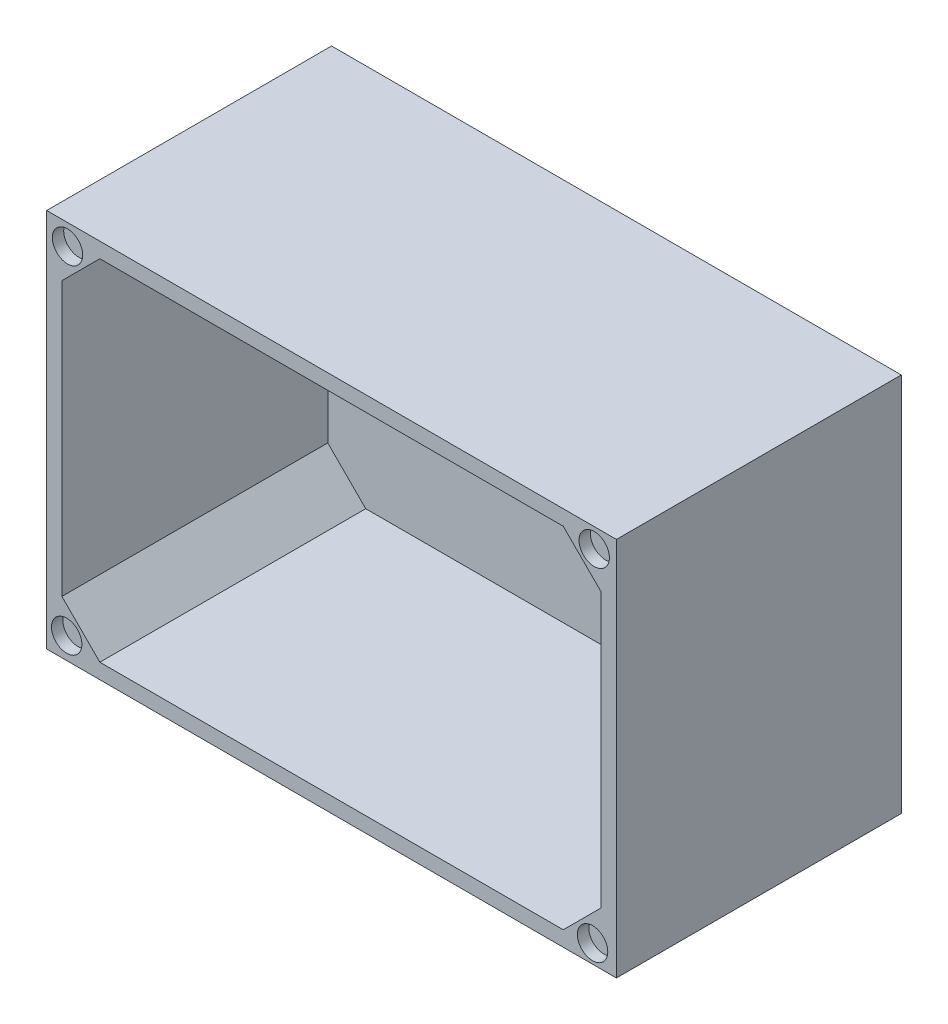
ISO-10303-21;
HEADER;
FILE_DESCRIPTION(('STEP AP214'),'2;1');
FILE_NAME('part.step','',(''),(''),'','','');
FILE_SCHEMA(('AUTOMOTIVE_DESIGN { 1 0 10303 214 1 1 1 1 }'));
ENDSEC;
DATA;
#1=APPLICATION_CONTEXT('core data for automotive mechanical design processes');
#2=APPLICATION_PROTOCOL_DEFINITION('international standard','automotive_design',2000,#1);
#3=PRODUCT_CONTEXT('',#1,'mechanical');
#4=PRODUCT('Part','Part','',(#3));
#5=PRODUCT_RELATED_PRODUCT_CATEGORY('part','',(#4));
#6=PRODUCT_DEFINITION_FORMATION('','',#4);
#7=PRODUCT_DEFINITION_CONTEXT('part definition',#1,'design');
#8=PRODUCT_DEFINITION('design','',#6,#7);
#9=PRODUCT_DEFINITION_SHAPE('','',#8);
#10=(LENGTH_UNIT() NAMED_UNIT(*) SI_UNIT(.MILLI.,.METRE.));
#11=(NAMED_UNIT(*) PLANE_ANGLE_UNIT() SI_UNIT($,.RADIAN.));
#12=(NAMED_UNIT(*) SI_UNIT($,.STERADIAN.) SOLID_ANGLE_UNIT());
#13=UNCERTAINTY_MEASURE_WITH_UNIT(LENGTH_MEASURE(1.E-05),#10,'distance_accuracy_value','');
#14=(GEOMETRIC_REPRESENTATION_CONTEXT(3) GLOBAL_UNCERTAINTY_ASSIGNED_CONTEXT((#13)) GLOBAL_UNIT_ASSIGNED_CONTEXT((#10,
#11,#12)) REPRESENTATION_CONTEXT('',''));
#15=CARTESIAN_POINT('',(0.,0.,0.));
#16=DIRECTION('',(0.,0.,1.));
#17=DIRECTION('',(1.,0.,0.));
#18=AXIS2_PLACEMENT_3D('',#15,#16,#17);
#19=CARTESIAN_POINT('',(0.,0.,75.0000000000001));
#20=DIRECTION('',(0.,0.,1.));
#21=DIRECTION('',(1.,0.,0.));
#22=AXIS2_PLACEMENT_3D('',#19,#20,#21);
#23=PLANE('',#22);
#24=CARTESIAN_POINT('',(92.9547795066869,-5.11567158608324,75.0000000000001));
#25=DIRECTION('',(0.,0.,1.));
#26=DIRECTION('',(1.,0.,0.));
#27=AXIS2_PLACEMENT_3D('',#24,#25,#26);
#28=CIRCLE('',#27,4.00000000000001);
#29=CARTESIAN_POINT('',(96.9547795066869,-5.11567158608324,75.0000000000001));
#30=VERTEX_POINT('',#29);
#31=EDGE_CURVE('E302',#30,#30,#28,.T.);
#32=ORIENTED_EDGE('',*,*,#31,.F.);
#33=EDGE_LOOP('',(#32));
#34=FACE_BOUND('',#33,.T.);
#35=CARTESIAN_POINT('',(92.5260140571219,-95.1957072309636,75.0000000000001));
#36=DIRECTION('',(0.,0.,1.));
#37=DIRECTION('',(1.,0.,0.));
#38=AXIS2_PLACEMENT_3D('',#35,#36,#37);
#39=CIRCLE('',#38,4.00000000000001);
#40=CARTESIAN_POINT('',(96.5260140571219,-95.1957072309636,75.0000000000001));
#41=VERTEX_POINT('',#40);
#42=EDGE_CURVE('E310',#41,#41,#39,.T.);
#43=ORIENTED_EDGE('',*,*,#42,.F.);
#44=EDGE_LOOP('',(#43));
#45=FACE_BOUND('',#44,.T.);
#46=CARTESIAN_POINT('',(-45.9310016615479,-94.3213659545927,75.0000000000001));
#47=DIRECTION('',(0.,0.,1.));
#48=DIRECTION('',(1.,0.,0.));
#49=AXIS2_PLACEMENT_3D('',#46,#47,#48);
#50=CIRCLE('',#49,4.00000000000001);
#51=CARTESIAN_POINT('',(-41.9310016615479,-94.3213659545927,75.0000000000001));
#52=VERTEX_POINT('',#51);
#53=EDGE_CURVE('E320',#52,#52,#50,.T.);
#54=ORIENTED_EDGE('',*,*,#53,.F.);
#55=EDGE_LOOP('',(#54));
#56=FACE_BOUND('',#55,.T.);
#57=CARTESIAN_POINT('',(-45.7114952001511,-5.44696224153471,75.0000000000001));
#58=DIRECTION('',(0.,0.,1.));
#59=DIRECTION('',(1.,0.,0.));
#60=AXIS2_PLACEMENT_3D('',#57,#58,#59);
#61=CIRCLE('',#60,4.);
#62=CARTESIAN_POINT('',(-41.7114952001511,-5.44696224153471,75.0000000000001));
#63=VERTEX_POINT('',#62);
#64=EDGE_CURVE('E301',#63,#63,#61,.T.);
#65=ORIENTED_EDGE('',*,*,#64,.F.);
#66=EDGE_LOOP('',(#65));
#67=FACE_BOUND('',#66,.T.);
#68=DIRECTION('',(0.,-1.,0.));
#69=VECTOR('',#68,1.);
#70=CARTESIAN_POINT('',(-51.1935522377198,0.,75.0000000000001));
#71=LINE('',#70,#69);
#72=CARTESIAN_POINT('',(-51.1935522377198,0.,75.0000000000001));
#73=VERTEX_POINT('',#72);
#74=CARTESIAN_POINT('',(-51.1935522377198,-100.,75.0000000000001));
#75=VERTEX_POINT('',#74);
#76=EDGE_CURVE('E179',#73,#75,#71,.T.);
#77=ORIENTED_EDGE('',*,*,#76,.T.);
#78=DIRECTION('',(1.,0.,0.));
#79=VECTOR('',#78,1.);
#80=CARTESIAN_POINT('',(-51.1935522377198,-100.,75.0000000000001));
#81=LINE('',#80,#79);
#82=CARTESIAN_POINT('',(98.8064477622802,-100.,75.0000000000001));
#83=VERTEX_POINT('',#82);
#84=EDGE_CURVE('E97',#75,#83,#81,.T.);
#85=ORIENTED_EDGE('',*,*,#84,.T.);
#86=DIRECTION('',(0.,1.,0.));
#87=VECTOR('',#86,1.);
#88=CARTESIAN_POINT('',(98.8064477622802,0.,75.0000000000001));
#89=LINE('',#88,#87);
#90=CARTESIAN_POINT('',(98.8064477622802,0.,75.0000000000001));
#91=VERTEX_POINT('',#90);
#92=EDGE_CURVE('E184',#83,#91,#89,.T.);
#93=ORIENTED_EDGE('',*,*,#92,.T.);
#94=DIRECTION('',(-1.,0.,0.));
#95=VECTOR('',#94,1.);
#96=CARTESIAN_POINT('',(-51.1935522377198,0.,75.0000000000001));
#97=LINE('',#96,#95);
#98=EDGE_CURVE('E69',#91,#73,#97,.T.);
#99=ORIENTED_EDGE('',*,*,#98,.T.);
#100=EDGE_LOOP('',(#77,#85,#93,#99));
#101=FACE_BOUND('',#100,.T.);
#102=DIRECTION('',(0.,-1.,0.));
#103=VECTOR('',#102,1.);
#104=CARTESIAN_POINT('',(-47.1935522377198,-14.,75.0000000000001));
#105=LINE('',#104,#103);
#106=CARTESIAN_POINT('',(-47.1935522377198,-14.,75.0000000000001));
#107=VERTEX_POINT('',#106);
#108=CARTESIAN_POINT('',(-47.1935522377198,-86.,75.0000000000001));
#109=VERTEX_POINT('',#108);
#110=EDGE_CURVE('E161',#107,#109,#105,.T.);
#111=ORIENTED_EDGE('',*,*,#110,.F.);
#112=DIRECTION('',(0.707106781186548,0.707106781186547,0.));
#113=VECTOR('',#112,1.);
#114=CARTESIAN_POINT('',(-47.1935522377198,-14.,75.0000000000001));
#115=LINE('',#114,#113);
#116=CARTESIAN_POINT('',(-37.1935522377198,-4.,75.0000000000001));
#117=VERTEX_POINT('',#116);
#118=EDGE_CURVE('E60',#107,#117,#115,.T.);
#119=ORIENTED_EDGE('',*,*,#118,.T.);
#120=DIRECTION('',(1.,0.,0.));
#121=VECTOR('',#120,1.);
#122=CARTESIAN_POINT('',(-37.1935522377198,-4.,75.0000000000001));
#123=LINE('',#122,#121);
#124=CARTESIAN_POINT('',(84.8064477622802,-4.,75.0000000000001));
#125=VERTEX_POINT('',#124);
#126=EDGE_CURVE('E165',#117,#125,#123,.T.);
#127=ORIENTED_EDGE('',*,*,#126,.T.);
#128=DIRECTION('',(0.707106781186547,-0.707106781186548,0.));
#129=VECTOR('',#128,1.);
#130=CARTESIAN_POINT('',(84.8064477622802,-4.,75.0000000000001));
#131=LINE('',#130,#129);
#132=CARTESIAN_POINT('',(94.8064477622802,-14.,75.0000000000001));
#133=VERTEX_POINT('',#132);
#134=EDGE_CURVE('E355',#125,#133,#131,.T.);
#135=ORIENTED_EDGE('',*,*,#134,.T.);
#136=DIRECTION('',(0.,-1.,0.));
#137=VECTOR('',#136,1.);
#138=CARTESIAN_POINT('',(94.8064477622802,-14.,75.0000000000001));
#139=LINE('',#138,#137);
#140=CARTESIAN_POINT('',(94.8064477622802,-86.,75.0000000000001));
#141=VERTEX_POINT('',#140);
#142=EDGE_CURVE('E359',#133,#141,#139,.T.);
#143=ORIENTED_EDGE('',*,*,#142,.T.);
#144=DIRECTION('',(0.707106781186547,0.707106781186547,0.));
#145=VECTOR('',#144,1.);
#146=CARTESIAN_POINT('',(84.8064477622802,-96.,75.0000000000001));
#147=LINE('',#146,#145);
#148=CARTESIAN_POINT('',(84.8064477622802,-96.,75.0000000000001));
#149=VERTEX_POINT('',#148);
#150=EDGE_CURVE('E363',#149,#141,#147,.T.);
#151=ORIENTED_EDGE('',*,*,#150,.F.);
#152=DIRECTION('',(1.,0.,0.));
#153=VECTOR('',#152,1.);
#154=CARTESIAN_POINT('',(-37.1935522377198,-96.,75.0000000000001));
#155=LINE('',#154,#153);
#156=CARTESIAN_POINT('',(-37.1935522377198,-96.,75.0000000000001));
#157=VERTEX_POINT('',#156);
#158=EDGE_CURVE('E367',#157,#149,#155,.T.);
#159=ORIENTED_EDGE('',*,*,#158,.F.);
#160=DIRECTION('',(0.707106781186548,-0.707106781186547,0.));
#161=VECTOR('',#160,1.);
#162=CARTESIAN_POINT('',(-47.1935522377198,-86.,75.0000000000001));
#163=LINE('',#162,#161);
#164=EDGE_CURVE('E371',#109,#157,#163,.T.);
#165=ORIENTED_EDGE('',*,*,#164,.F.);
#166=EDGE_LOOP('',(#111,#119,#127,#135,#143,#151,#159,#165));
#167=FACE_BOUND('',#166,.T.);
#168=ADVANCED_FACE('F44',(#34,#45,#56,#67,#101,#167),#23,.T.);
#169=CARTESIAN_POINT('',(-51.1935522377198,0.,75.0000000000001));
#170=DIRECTION('',(1.,0.,0.));
#171=DIRECTION('',(0.,1.,0.));
#172=AXIS2_PLACEMENT_3D('',#169,#170,#171);
#173=PLANE('',#172);
#174=DIRECTION('',(0.,-1.,0.));
#175=VECTOR('',#174,1.);
#176=CARTESIAN_POINT('',(-51.1935522377198,0.,0.));
#177=LINE('',#176,#175);
#178=CARTESIAN_POINT('',(-51.1935522377198,0.,0.));
#179=VERTEX_POINT('',#178);
#180=CARTESIAN_POINT('',(-51.1935522377198,-100.,0.));
#181=VERTEX_POINT('',#180);
#182=EDGE_CURVE('E167',#179,#181,#177,.T.);
#183=ORIENTED_EDGE('',*,*,#182,.T.);
#184=DIRECTION('',(0.,0.,-1.));
#185=VECTOR('',#184,1.);
#186=CARTESIAN_POINT('',(-51.1935522377198,-100.,75.0000000000001));
#187=LINE('',#186,#185);
#188=EDGE_CURVE('E11',#75,#181,#187,.T.);
#189=ORIENTED_EDGE('',*,*,#188,.F.);
#190=ORIENTED_EDGE('',*,*,#76,.F.);
#191=DIRECTION('',(0.,0.,-1.));
#192=VECTOR('',#191,1.);
#193=CARTESIAN_POINT('',(-51.1935522377198,0.,75.0000000000001));
#194=LINE('',#193,#192);
#195=EDGE_CURVE('E188',#73,#179,#194,.T.);
#196=ORIENTED_EDGE('',*,*,#195,.T.);
#197=EDGE_LOOP('',(#183,#189,#190,#196));
#198=FACE_BOUND('',#197,.T.);
#199=ADVANCED_FACE('F46',(#198),#173,.F.);
#200=CARTESIAN_POINT('',(-51.1935522377198,-100.,75.0000000000001));
#201=DIRECTION('',(0.,1.,0.));
#202=DIRECTION('',(0.,0.,1.));
#203=AXIS2_PLACEMENT_3D('',#200,#201,#202);
#204=PLANE('',#203);
#205=DIRECTION('',(1.,0.,0.));
#206=VECTOR('',#205,1.);
#207=CARTESIAN_POINT('',(-51.1935522377198,-100.,0.));
#208=LINE('',#207,#206);
#209=CARTESIAN_POINT('',(98.8064477622802,-100.,0.));
#210=VERTEX_POINT('',#209);
#211=EDGE_CURVE('E173',#181,#210,#208,.T.);
#212=ORIENTED_EDGE('',*,*,#211,.T.);
#213=DIRECTION('',(0.,0.,-1.));
#214=VECTOR('',#213,1.);
#215=CARTESIAN_POINT('',(98.8064477622802,-100.,75.0000000000001));
#216=LINE('',#215,#214);
#217=EDGE_CURVE('E53',#83,#210,#216,.T.);
#218=ORIENTED_EDGE('',*,*,#217,.F.);
#219=ORIENTED_EDGE('',*,*,#84,.F.);
#220=ORIENTED_EDGE('',*,*,#188,.T.);
#221=EDGE_LOOP('',(#212,#218,#219,#220));
#222=FACE_BOUND('',#221,.T.);
#223=ADVANCED_FACE('F222',(#222),#204,.F.);
#224=CARTESIAN_POINT('',(98.8064477622802,0.,75.0000000000001));
#225=DIRECTION('',(-1.,0.,0.));
#226=DIRECTION('',(0.,-1.,0.));
#227=AXIS2_PLACEMENT_3D('',#224,#225,#226);
#228=PLANE('',#227);
#229=DIRECTION('',(0.,1.,0.));
#230=VECTOR('',#229,1.);
#231=CARTESIAN_POINT('',(98.8064477622802,0.,0.));
#232=LINE('',#231,#230);
#233=CARTESIAN_POINT('',(98.8064477622802,0.,0.));
#234=VERTEX_POINT('',#233);
#235=EDGE_CURVE('E192',#210,#234,#232,.T.);
#236=ORIENTED_EDGE('',*,*,#235,.T.);
#237=DIRECTION('',(0.,0.,-1.));
#238=VECTOR('',#237,1.);
#239=CARTESIAN_POINT('',(98.8064477622802,0.,75.0000000000001));
#240=LINE('',#239,#238);
#241=EDGE_CURVE('E199',#91,#234,#240,.T.);
#242=ORIENTED_EDGE('',*,*,#241,.F.);
#243=ORIENTED_EDGE('',*,*,#92,.F.);
#244=ORIENTED_EDGE('',*,*,#217,.T.);
#245=EDGE_LOOP('',(#236,#242,#243,#244));
#246=FACE_BOUND('',#245,.T.);
#247=ADVANCED_FACE('F206',(#246),#228,.F.);
#248=CARTESIAN_POINT('',(-51.1935522377198,0.,75.0000000000001));
#249=DIRECTION('',(0.,-1.,0.));
#250=DIRECTION('',(0.,0.,-1.));
#251=AXIS2_PLACEMENT_3D('',#248,#249,#250);
#252=PLANE('',#251);
#253=DIRECTION('',(-1.,0.,0.));
#254=VECTOR('',#253,1.);
#255=CARTESIAN_POINT('',(-51.1935522377198,0.,0.));
#256=LINE('',#255,#254);
#257=EDGE_CURVE('E90',#234,#179,#256,.T.);
#258=ORIENTED_EDGE('',*,*,#257,.T.);
#259=ORIENTED_EDGE('',*,*,#195,.F.);
#260=ORIENTED_EDGE('',*,*,#98,.F.);
#261=ORIENTED_EDGE('',*,*,#241,.T.);
#262=EDGE_LOOP('',(#258,#259,#260,#261));
#263=FACE_BOUND('',#262,.T.);
#264=ADVANCED_FACE('F214',(#263),#252,.F.);
#265=CARTESIAN_POINT('',(0.,0.,0.));
#266=DIRECTION('',(0.,0.,1.));
#267=DIRECTION('',(1.,0.,0.));
#268=AXIS2_PLACEMENT_3D('',#265,#266,#267);
#269=PLANE('',#268);
#270=ORIENTED_EDGE('',*,*,#182,.F.);
#271=ORIENTED_EDGE('',*,*,#257,.F.);
#272=ORIENTED_EDGE('',*,*,#235,.F.);
#273=ORIENTED_EDGE('',*,*,#211,.F.);
#274=EDGE_LOOP('',(#270,#271,#272,#273));
#275=FACE_BOUND('',#274,.T.);
#276=ADVANCED_FACE('F210',(#275),#269,.F.);
#277=CARTESIAN_POINT('',(-47.1935522377198,-14.,5.00000000000002));
#278=DIRECTION('',(0.707106781186547,-0.707106781186548,0.));
#279=DIRECTION('',(0.707106781186548,0.707106781186547,0.));
#280=AXIS2_PLACEMENT_3D('',#277,#278,#279);
#281=PLANE('',#280);
#282=ORIENTED_EDGE('',*,*,#118,.F.);
#283=DIRECTION('',(0.,0.,1.));
#284=VECTOR('',#283,1.);
#285=CARTESIAN_POINT('',(-47.1935522377198,-14.,5.00000000000002));
#286=LINE('',#285,#284);
#287=CARTESIAN_POINT('',(-47.1935522377198,-14.,5.00000000000002));
#288=VERTEX_POINT('',#287);
#289=EDGE_CURVE('E159',#288,#107,#286,.T.);
#290=ORIENTED_EDGE('',*,*,#289,.F.);
#291=DIRECTION('',(0.707106781186548,0.707106781186547,0.));
#292=VECTOR('',#291,1.);
#293=CARTESIAN_POINT('',(-47.1935522377198,-14.,5.00000000000002));
#294=LINE('',#293,#292);
#295=CARTESIAN_POINT('',(-37.1935522377198,-4.,5.00000000000002));
#296=VERTEX_POINT('',#295);
#297=EDGE_CURVE('E148',#288,#296,#294,.T.);
#298=ORIENTED_EDGE('',*,*,#297,.T.);
#299=DIRECTION('',(0.,0.,1.));
#300=VECTOR('',#299,1.);
#301=CARTESIAN_POINT('',(-37.1935522377198,-4.,5.00000000000002));
#302=LINE('',#301,#300);
#303=EDGE_CURVE('E158',#296,#117,#302,.T.);
#304=ORIENTED_EDGE('',*,*,#303,.T.);
#305=EDGE_LOOP('',(#282,#290,#298,#304));
#306=FACE_BOUND('',#305,.T.);
#307=ADVANCED_FACE('F157',(#306),#281,.T.);
#308=CARTESIAN_POINT('',(-37.1935522377198,-4.,5.00000000000002));
#309=DIRECTION('',(0.,-1.,0.));
#310=DIRECTION('',(0.,0.,-1.));
#311=AXIS2_PLACEMENT_3D('',#308,#309,#310);
#312=PLANE('',#311);
#313=ORIENTED_EDGE('',*,*,#126,.F.);
#314=ORIENTED_EDGE('',*,*,#303,.F.);
#315=DIRECTION('',(1.,0.,0.));
#316=VECTOR('',#315,1.);
#317=CARTESIAN_POINT('',(-37.1935522377198,-4.,5.00000000000002));
#318=LINE('',#317,#316);
#319=CARTESIAN_POINT('',(84.8064477622802,-4.,5.00000000000002));
#320=VERTEX_POINT('',#319);
#321=EDGE_CURVE('E144',#296,#320,#318,.T.);
#322=ORIENTED_EDGE('',*,*,#321,.T.);
#323=DIRECTION('',(0.,0.,1.));
#324=VECTOR('',#323,1.);
#325=CARTESIAN_POINT('',(84.8064477622802,-4.,5.00000000000002));
#326=LINE('',#325,#324);
#327=EDGE_CURVE('E168',#320,#125,#326,.T.);
#328=ORIENTED_EDGE('',*,*,#327,.T.);
#329=EDGE_LOOP('',(#313,#314,#322,#328));
#330=FACE_BOUND('',#329,.T.);
#331=ADVANCED_FACE('F163',(#330),#312,.T.);
#332=CARTESIAN_POINT('',(84.8064477622802,-4.,5.00000000000002));
#333=DIRECTION('',(-0.707106781186548,-0.707106781186547,0.));
#334=DIRECTION('',(0.707106781186547,-0.707106781186548,0.));
#335=AXIS2_PLACEMENT_3D('',#332,#333,#334);
#336=PLANE('',#335);
#337=ORIENTED_EDGE('',*,*,#134,.F.);
#338=ORIENTED_EDGE('',*,*,#327,.F.);
#339=DIRECTION('',(0.707106781186547,-0.707106781186548,0.));
#340=VECTOR('',#339,1.);
#341=CARTESIAN_POINT('',(84.8064477622802,-4.,5.00000000000002));
#342=LINE('',#341,#340);
#343=CARTESIAN_POINT('',(94.8064477622802,-14.,5.00000000000002));
#344=VERTEX_POINT('',#343);
#345=EDGE_CURVE('E151',#320,#344,#342,.T.);
#346=ORIENTED_EDGE('',*,*,#345,.T.);
#347=DIRECTION('',(0.,0.,1.));
#348=VECTOR('',#347,1.);
#349=CARTESIAN_POINT('',(94.8064477622802,-14.,5.00000000000002));
#350=LINE('',#349,#348);
#351=EDGE_CURVE('E175',#344,#133,#350,.T.);
#352=ORIENTED_EDGE('',*,*,#351,.T.);
#353=EDGE_LOOP('',(#337,#338,#346,#352));
#354=FACE_BOUND('',#353,.T.);
#355=ADVANCED_FACE('F238',(#354),#336,.T.);
#356=CARTESIAN_POINT('',(94.8064477622802,-14.,5.00000000000002));
#357=DIRECTION('',(-1.,0.,0.));
#358=DIRECTION('',(0.,0.,1.));
#359=AXIS2_PLACEMENT_3D('',#356,#357,#358);
#360=PLANE('',#359);
#361=ORIENTED_EDGE('',*,*,#142,.F.);
#362=ORIENTED_EDGE('',*,*,#351,.F.);
#363=DIRECTION('',(0.,-1.,0.));
#364=VECTOR('',#363,1.);
#365=CARTESIAN_POINT('',(94.8064477622802,-14.,5.00000000000002));
#366=LINE('',#365,#364);
#367=CARTESIAN_POINT('',(94.8064477622802,-86.,5.00000000000002));
#368=VERTEX_POINT('',#367);
#369=EDGE_CURVE('E333',#344,#368,#366,.T.);
#370=ORIENTED_EDGE('',*,*,#369,.T.);
#371=DIRECTION('',(0.,0.,1.));
#372=VECTOR('',#371,1.);
#373=CARTESIAN_POINT('',(94.8064477622802,-86.,5.00000000000002));
#374=LINE('',#373,#372);
#375=EDGE_CURVE('E389',#368,#141,#374,.T.);
#376=ORIENTED_EDGE('',*,*,#375,.T.);
#377=EDGE_LOOP('',(#361,#362,#370,#376));
#378=FACE_BOUND('',#377,.T.);
#379=ADVANCED_FACE('F241',(#378),#360,.T.);
#380=CARTESIAN_POINT('',(84.8064477622802,-96.,5.00000000000002));
#381=DIRECTION('',(0.707106781186547,-0.707106781186547,0.));
#382=DIRECTION('',(0.707106781186548,0.707106781186548,0.));
#383=AXIS2_PLACEMENT_3D('',#380,#381,#382);
#384=PLANE('',#383);
#385=ORIENTED_EDGE('',*,*,#150,.T.);
#386=ORIENTED_EDGE('',*,*,#375,.F.);
#387=DIRECTION('',(0.707106781186547,0.707106781186547,0.));
#388=VECTOR('',#387,1.);
#389=CARTESIAN_POINT('',(84.8064477622802,-96.,5.00000000000002));
#390=LINE('',#389,#388);
#391=CARTESIAN_POINT('',(84.8064477622802,-96.,5.00000000000002));
#392=VERTEX_POINT('',#391);
#393=EDGE_CURVE('E336',#392,#368,#390,.T.);
#394=ORIENTED_EDGE('',*,*,#393,.F.);
#395=DIRECTION('',(0.,0.,1.));
#396=VECTOR('',#395,1.);
#397=CARTESIAN_POINT('',(84.8064477622802,-96.,5.00000000000002));
#398=LINE('',#397,#396);
#399=EDGE_CURVE('E386',#392,#149,#398,.T.);
#400=ORIENTED_EDGE('',*,*,#399,.T.);
#401=EDGE_LOOP('',(#385,#386,#394,#400));
#402=FACE_BOUND('',#401,.T.);
#403=ADVANCED_FACE('F245',(#402),#384,.F.);
#404=CARTESIAN_POINT('',(-37.1935522377198,-96.,5.00000000000002));
#405=DIRECTION('',(0.,-1.,0.));
#406=DIRECTION('',(0.,0.,-1.));
#407=AXIS2_PLACEMENT_3D('',#404,#405,#406);
#408=PLANE('',#407);
#409=ORIENTED_EDGE('',*,*,#158,.T.);
#410=ORIENTED_EDGE('',*,*,#399,.F.);
#411=DIRECTION('',(1.,0.,0.));
#412=VECTOR('',#411,1.);
#413=CARTESIAN_POINT('',(-37.1935522377198,-96.,5.00000000000002));
#414=LINE('',#413,#412);
#415=CARTESIAN_POINT('',(-37.1935522377198,-96.,5.00000000000002));
#416=VERTEX_POINT('',#415);
#417=EDGE_CURVE('E340',#416,#392,#414,.T.);
#418=ORIENTED_EDGE('',*,*,#417,.F.);
#419=DIRECTION('',(0.,0.,1.));
#420=VECTOR('',#419,1.);
#421=CARTESIAN_POINT('',(-37.1935522377198,-96.,5.00000000000002));
#422=LINE('',#421,#420);
#423=EDGE_CURVE('E383',#416,#157,#422,.T.);
#424=ORIENTED_EDGE('',*,*,#423,.T.);
#425=EDGE_LOOP('',(#409,#410,#418,#424));
#426=FACE_BOUND('',#425,.T.);
#427=ADVANCED_FACE('F249',(#426),#408,.F.);
#428=CARTESIAN_POINT('',(-47.1935522377198,-86.,5.00000000000002));
#429=DIRECTION('',(-0.707106781186547,-0.707106781186548,0.));
#430=DIRECTION('',(0.707106781186548,-0.707106781186547,0.));
#431=AXIS2_PLACEMENT_3D('',#428,#429,#430);
#432=PLANE('',#431);
#433=ORIENTED_EDGE('',*,*,#164,.T.);
#434=ORIENTED_EDGE('',*,*,#423,.F.);
#435=DIRECTION('',(0.707106781186548,-0.707106781186547,0.));
#436=VECTOR('',#435,1.);
#437=CARTESIAN_POINT('',(-47.1935522377198,-86.,5.00000000000002));
#438=LINE('',#437,#436);
#439=CARTESIAN_POINT('',(-47.1935522377198,-86.,5.00000000000002));
#440=VERTEX_POINT('',#439);
#441=EDGE_CURVE('E344',#440,#416,#438,.T.);
#442=ORIENTED_EDGE('',*,*,#441,.F.);
#443=DIRECTION('',(0.,0.,1.));
#444=VECTOR('',#443,1.);
#445=CARTESIAN_POINT('',(-47.1935522377198,-86.,5.00000000000002));
#446=LINE('',#445,#444);
#447=EDGE_CURVE('E380',#440,#109,#446,.T.);
#448=ORIENTED_EDGE('',*,*,#447,.T.);
#449=EDGE_LOOP('',(#433,#434,#442,#448));
#450=FACE_BOUND('',#449,.T.);
#451=ADVANCED_FACE('F253',(#450),#432,.F.);
#452=CARTESIAN_POINT('',(-47.1935522377198,-14.,5.00000000000002));
#453=DIRECTION('',(-1.,0.,0.));
#454=DIRECTION('',(0.,-1.,0.));
#455=AXIS2_PLACEMENT_3D('',#452,#453,#454);
#456=PLANE('',#455);
#457=ORIENTED_EDGE('',*,*,#110,.T.);
#458=ORIENTED_EDGE('',*,*,#447,.F.);
#459=DIRECTION('',(0.,-1.,0.));
#460=VECTOR('',#459,1.);
#461=CARTESIAN_POINT('',(-47.1935522377198,-14.,5.00000000000002));
#462=LINE('',#461,#460);
#463=EDGE_CURVE('E348',#288,#440,#462,.T.);
#464=ORIENTED_EDGE('',*,*,#463,.F.);
#465=ORIENTED_EDGE('',*,*,#289,.T.);
#466=EDGE_LOOP('',(#457,#458,#464,#465));
#467=FACE_BOUND('',#466,.T.);
#468=ADVANCED_FACE('F257',(#467),#456,.F.);
#469=CARTESIAN_POINT('',(0.,0.,5.00000000000002));
#470=DIRECTION('',(0.,0.,-1.));
#471=DIRECTION('',(-1.,0.,0.));
#472=AXIS2_PLACEMENT_3D('',#469,#470,#471);
#473=PLANE('',#472);
#474=ORIENTED_EDGE('',*,*,#297,.F.);
#475=ORIENTED_EDGE('',*,*,#463,.T.);
#476=ORIENTED_EDGE('',*,*,#441,.T.);
#477=ORIENTED_EDGE('',*,*,#417,.T.);
#478=ORIENTED_EDGE('',*,*,#393,.T.);
#479=ORIENTED_EDGE('',*,*,#369,.F.);
#480=ORIENTED_EDGE('',*,*,#345,.F.);
#481=ORIENTED_EDGE('',*,*,#321,.F.);
#482=EDGE_LOOP('',(#474,#475,#476,#477,#478,#479,#480,#481));
#483=FACE_BOUND('',#482,.T.);
#484=ADVANCED_FACE('F146',(#483),#473,.F.);
#485=CARTESIAN_POINT('',(-45.7114952001511,-5.44696224153471,72.));
#486=DIRECTION('',(0.,0.,1.));
#487=DIRECTION('',(1.,0.,0.));
#488=AXIS2_PLACEMENT_3D('',#485,#486,#487);
#489=CYLINDRICAL_SURFACE('',#488,4.);
#490=CARTESIAN_POINT('',(-45.7114952001511,-5.44696224153471,72.));
#491=DIRECTION('',(0.,0.,1.));
#492=DIRECTION('',(1.,0.,0.));
#493=AXIS2_PLACEMENT_3D('',#490,#491,#492);
#494=CIRCLE('',#493,4.);
#495=CARTESIAN_POINT('',(-41.7114952001511,-5.44696224153471,72.));
#496=VERTEX_POINT('',#495);
#497=EDGE_CURVE('E307',#496,#496,#494,.T.);
#498=ORIENTED_EDGE('',*,*,#497,.F.);
#499=EDGE_LOOP('',(#498));
#500=FACE_BOUND('',#499,.T.);
#501=ORIENTED_EDGE('',*,*,#64,.T.);
#502=EDGE_LOOP('',(#501));
#503=FACE_BOUND('',#502,.T.);
#504=ADVANCED_FACE('F264',(#500,#503),#489,.F.);
#505=CARTESIAN_POINT('',(-45.7114952001511,-5.44696224153471,72.));
#506=DIRECTION('',(0.,0.,1.));
#507=DIRECTION('',(1.,0.,0.));
#508=AXIS2_PLACEMENT_3D('',#505,#506,#507);
#509=PLANE('',#508);
#510=ORIENTED_EDGE('',*,*,#497,.T.);
#511=EDGE_LOOP('',(#510));
#512=FACE_BOUND('',#511,.T.);
#513=ADVANCED_FACE('F267',(#512),#509,.T.);
#514=CARTESIAN_POINT('',(-45.9310016615479,-94.3213659545927,72.));
#515=DIRECTION('',(0.,0.,1.));
#516=DIRECTION('',(1.,0.,0.));
#517=AXIS2_PLACEMENT_3D('',#514,#515,#516);
#518=CYLINDRICAL_SURFACE('',#517,4.00000000000001);
#519=CARTESIAN_POINT('',(-45.9310016615479,-94.3213659545927,72.));
#520=DIRECTION('',(0.,0.,1.));
#521=DIRECTION('',(1.,0.,0.));
#522=AXIS2_PLACEMENT_3D('',#519,#520,#521);
#523=CIRCLE('',#522,4.00000000000001);
#524=CARTESIAN_POINT('',(-41.9310016615479,-94.3213659545927,72.));
#525=VERTEX_POINT('',#524);
#526=EDGE_CURVE('E324',#525,#525,#523,.T.);
#527=ORIENTED_EDGE('',*,*,#526,.F.);
#528=EDGE_LOOP('',(#527));
#529=FACE_BOUND('',#528,.T.);
#530=ORIENTED_EDGE('',*,*,#53,.T.);
#531=EDGE_LOOP('',(#530));
#532=FACE_BOUND('',#531,.T.);
#533=ADVANCED_FACE('F271',(#529,#532),#518,.F.);
#534=CARTESIAN_POINT('',(-45.9310016615479,-94.3213659545927,72.));
#535=DIRECTION('',(0.,0.,1.));
#536=DIRECTION('',(1.,0.,0.));
#537=AXIS2_PLACEMENT_3D('',#534,#535,#536);
#538=PLANE('',#537);
#539=ORIENTED_EDGE('',*,*,#526,.T.);
#540=EDGE_LOOP('',(#539));
#541=FACE_BOUND('',#540,.T.);
#542=ADVANCED_FACE('F273',(#541),#538,.T.);
#543=CARTESIAN_POINT('',(92.5260140571219,-95.1957072309636,72.));
#544=DIRECTION('',(0.,0.,1.));
#545=DIRECTION('',(1.,0.,0.));
#546=AXIS2_PLACEMENT_3D('',#543,#544,#545);
#547=CYLINDRICAL_SURFACE('',#546,4.00000000000001);
#548=CARTESIAN_POINT('',(92.5260140571219,-95.1957072309636,72.));
#549=DIRECTION('',(0.,0.,1.));
#550=DIRECTION('',(1.,0.,0.));
#551=AXIS2_PLACEMENT_3D('',#548,#549,#550);
#552=CIRCLE('',#551,4.00000000000001);
#553=CARTESIAN_POINT('',(96.5260140571219,-95.1957072309636,72.));
#554=VERTEX_POINT('',#553);
#555=EDGE_CURVE('E316',#554,#554,#552,.T.);
#556=ORIENTED_EDGE('',*,*,#555,.F.);
#557=EDGE_LOOP('',(#556));
#558=FACE_BOUND('',#557,.T.);
#559=ORIENTED_EDGE('',*,*,#42,.T.);
#560=EDGE_LOOP('',(#559));
#561=FACE_BOUND('',#560,.T.);
#562=ADVANCED_FACE('F276',(#558,#561),#547,.F.);
#563=CARTESIAN_POINT('',(92.5260140571219,-95.1957072309636,72.));
#564=DIRECTION('',(0.,0.,1.));
#565=DIRECTION('',(1.,0.,0.));
#566=AXIS2_PLACEMENT_3D('',#563,#564,#565);
#567=PLANE('',#566);
#568=ORIENTED_EDGE('',*,*,#555,.T.);
#569=EDGE_LOOP('',(#568));
#570=FACE_BOUND('',#569,.T.);
#571=ADVANCED_FACE('F281',(#570),#567,.T.);
#572=CARTESIAN_POINT('',(92.9547795066869,-5.11567158608324,72.));
#573=DIRECTION('',(0.,0.,1.));
#574=DIRECTION('',(1.,0.,0.));
#575=AXIS2_PLACEMENT_3D('',#572,#573,#574);
#576=CYLINDRICAL_SURFACE('',#575,4.00000000000001);
#577=CARTESIAN_POINT('',(92.9547795066869,-5.11567158608324,72.));
#578=DIRECTION('',(0.,0.,1.));
#579=DIRECTION('',(1.,0.,0.));
#580=AXIS2_PLACEMENT_3D('',#577,#578,#579);
#581=CIRCLE('',#580,4.00000000000001);
#582=CARTESIAN_POINT('',(96.9547795066869,-5.11567158608324,72.));
#583=VERTEX_POINT('',#582);
#584=EDGE_CURVE('E299',#583,#583,#581,.T.);
#585=ORIENTED_EDGE('',*,*,#584,.F.);
#586=EDGE_LOOP('',(#585));
#587=FACE_BOUND('',#586,.T.);
#588=ORIENTED_EDGE('',*,*,#31,.T.);
#589=EDGE_LOOP('',(#588));
#590=FACE_BOUND('',#589,.T.);
#591=ADVANCED_FACE('F284',(#587,#590),#576,.F.);
#592=CARTESIAN_POINT('',(92.9547795066869,-5.11567158608324,72.));
#593=DIRECTION('',(0.,0.,1.));
#594=DIRECTION('',(1.,0.,0.));
#595=AXIS2_PLACEMENT_3D('',#592,#593,#594);
#596=PLANE('',#595);
#597=ORIENTED_EDGE('',*,*,#584,.T.);
#598=EDGE_LOOP('',(#597));
#599=FACE_BOUND('',#598,.T.);
#600=ADVANCED_FACE('F291',(#599),#596,.T.);
#601=CLOSED_SHELL('',(#168,#199,#223,#247,#264,#276,#307,#331,#355,#379,#403,#427,#451,#468,
#484,#504,#513,#533,#542,#562,#571,#591,#600));
#602=MANIFOLD_SOLID_BREP('B2',#601);
#603=ADVANCED_BREP_SHAPE_REPRESENTATION('',(#18,#602),#14);
#604=SHAPE_DEFINITION_REPRESENTATION(#9,#603);
ENDSEC;
END-ISO-10303-21;
